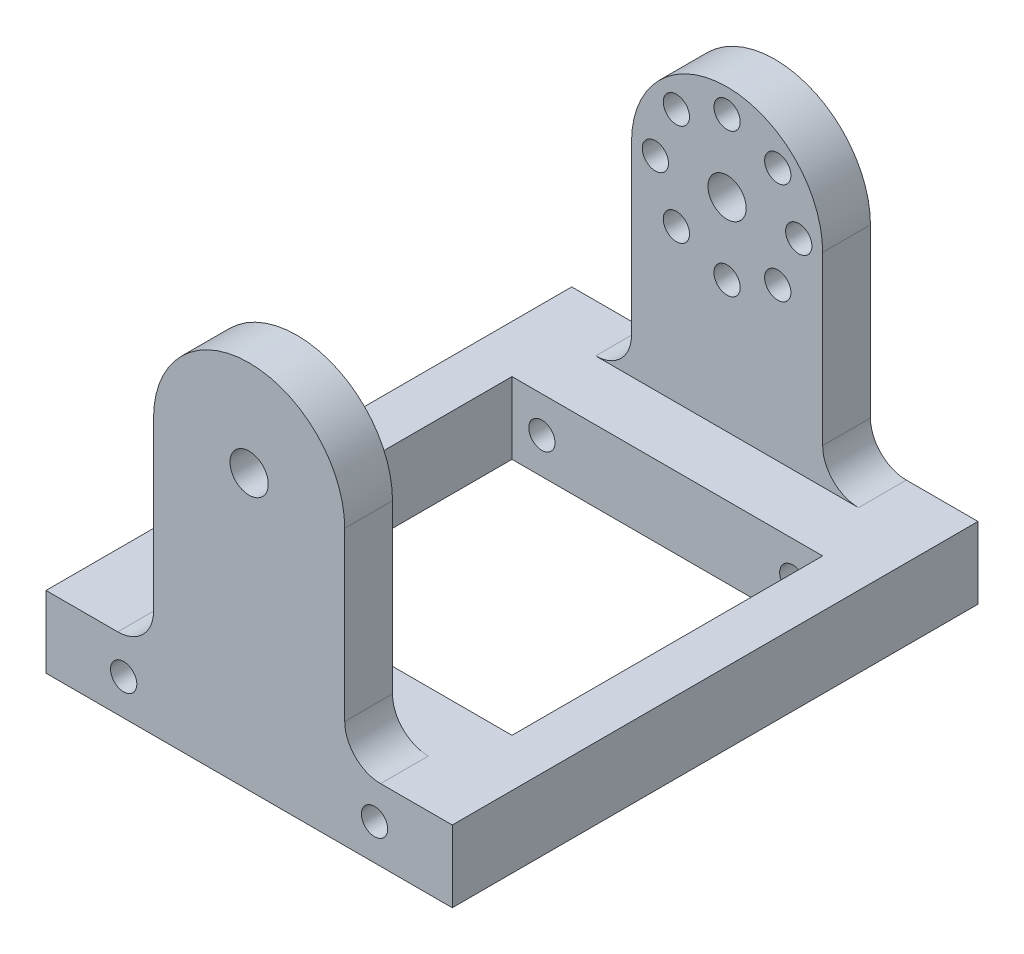
ISO-10303-21;
HEADER;
FILE_DESCRIPTION(('STEP AP214'),'2;1');
FILE_NAME('part.step','',(''),(''),'','','');
FILE_SCHEMA(('AUTOMOTIVE_DESIGN { 1 0 10303 214 1 1 1 1 }'));
ENDSEC;
DATA;
#1=APPLICATION_CONTEXT('core data for automotive mechanical design processes');
#2=APPLICATION_PROTOCOL_DEFINITION('international standard','automotive_design',2000,#1);
#3=PRODUCT_CONTEXT('',#1,'mechanical');
#4=PRODUCT('Part','Part','',(#3));
#5=PRODUCT_RELATED_PRODUCT_CATEGORY('part','',(#4));
#6=PRODUCT_DEFINITION_FORMATION('','',#4);
#7=PRODUCT_DEFINITION_CONTEXT('part definition',#1,'design');
#8=PRODUCT_DEFINITION('design','',#6,#7);
#9=PRODUCT_DEFINITION_SHAPE('','',#8);
#10=(LENGTH_UNIT() NAMED_UNIT(*) SI_UNIT(.MILLI.,.METRE.));
#11=(NAMED_UNIT(*) PLANE_ANGLE_UNIT() SI_UNIT($,.RADIAN.));
#12=(NAMED_UNIT(*) SI_UNIT($,.STERADIAN.) SOLID_ANGLE_UNIT());
#13=UNCERTAINTY_MEASURE_WITH_UNIT(LENGTH_MEASURE(1.E-05),#10,'distance_accuracy_value','');
#14=(GEOMETRIC_REPRESENTATION_CONTEXT(3) GLOBAL_UNCERTAINTY_ASSIGNED_CONTEXT((#13)) GLOBAL_UNIT_ASSIGNED_CONTEXT((#10,
#11,#12)) REPRESENTATION_CONTEXT('',''));
#15=CARTESIAN_POINT('',(0.,0.,0.));
#16=DIRECTION('',(0.,0.,1.));
#17=DIRECTION('',(1.,0.,0.));
#18=AXIS2_PLACEMENT_3D('',#15,#16,#17);
#19=CARTESIAN_POINT('',(11.,-14.,4.));
#20=DIRECTION('',(0.,0.,1.));
#21=DIRECTION('',(1.,0.,0.));
#22=AXIS2_PLACEMENT_3D('',#19,#20,#21);
#23=PLANE('',#22);
#24=CARTESIAN_POINT('',(-6.,0.,4.));
#25=DIRECTION('',(0.,0.,1.));
#26=DIRECTION('',(1.,0.,0.));
#27=AXIS2_PLACEMENT_3D('',#24,#25,#26);
#28=CIRCLE('',#27,1.1);
#29=CARTESIAN_POINT('',(-4.9,0.,4.));
#30=VERTEX_POINT('',#29);
#31=EDGE_CURVE('E221',#30,#30,#28,.T.);
#32=ORIENTED_EDGE('',*,*,#31,.F.);
#33=EDGE_LOOP('',(#32));
#34=FACE_BOUND('',#33,.T.);
#35=CARTESIAN_POINT('',(0.,-6.,4.));
#36=DIRECTION('',(0.,0.,1.));
#37=DIRECTION('',(1.,0.,0.));
#38=AXIS2_PLACEMENT_3D('',#35,#36,#37);
#39=CIRCLE('',#38,1.1);
#40=CARTESIAN_POINT('',(1.1,-6.,4.));
#41=VERTEX_POINT('',#40);
#42=EDGE_CURVE('E233',#41,#41,#39,.T.);
#43=ORIENTED_EDGE('',*,*,#42,.F.);
#44=EDGE_LOOP('',(#43));
#45=FACE_BOUND('',#44,.T.);
#46=CARTESIAN_POINT('',(6.,0.,4.));
#47=DIRECTION('',(0.,0.,1.));
#48=DIRECTION('',(1.,0.,0.));
#49=AXIS2_PLACEMENT_3D('',#46,#47,#48);
#50=CIRCLE('',#49,1.1);
#51=CARTESIAN_POINT('',(7.1,0.,4.));
#52=VERTEX_POINT('',#51);
#53=EDGE_CURVE('E245',#52,#52,#50,.T.);
#54=ORIENTED_EDGE('',*,*,#53,.F.);
#55=EDGE_LOOP('',(#54));
#56=FACE_BOUND('',#55,.T.);
#57=CARTESIAN_POINT('',(0.,6.,4.));
#58=DIRECTION('',(0.,0.,1.));
#59=DIRECTION('',(1.,0.,0.));
#60=AXIS2_PLACEMENT_3D('',#57,#58,#59);
#61=CIRCLE('',#60,1.1);
#62=CARTESIAN_POINT('',(1.1,6.,4.));
#63=VERTEX_POINT('',#62);
#64=EDGE_CURVE('E257',#63,#63,#61,.T.);
#65=ORIENTED_EDGE('',*,*,#64,.F.);
#66=EDGE_LOOP('',(#65));
#67=FACE_BOUND('',#66,.T.);
#68=CARTESIAN_POINT('',(0.,0.,4.));
#69=DIRECTION('',(0.,0.,1.));
#70=DIRECTION('',(1.,0.,0.));
#71=AXIS2_PLACEMENT_3D('',#68,#69,#70);
#72=CIRCLE('',#71,1.6);
#73=CARTESIAN_POINT('',(1.6,0.,4.));
#74=VERTEX_POINT('',#73);
#75=EDGE_CURVE('E263',#74,#74,#72,.T.);
#76=ORIENTED_EDGE('',*,*,#75,.F.);
#77=EDGE_LOOP('',(#76));
#78=FACE_BOUND('',#77,.T.);
#79=CARTESIAN_POINT('',(4.24264068711928,4.24264068711929,4.));
#80=DIRECTION('',(0.,0.,1.));
#81=DIRECTION('',(1.,0.,0.));
#82=AXIS2_PLACEMENT_3D('',#79,#80,#81);
#83=CIRCLE('',#82,1.1);
#84=CARTESIAN_POINT('',(5.34264068711929,4.24264068711929,4.));
#85=VERTEX_POINT('',#84);
#86=EDGE_CURVE('E251',#85,#85,#83,.T.);
#87=ORIENTED_EDGE('',*,*,#86,.F.);
#88=EDGE_LOOP('',(#87));
#89=FACE_BOUND('',#88,.T.);
#90=CARTESIAN_POINT('',(4.24264068711929,-4.24264068711928,4.));
#91=DIRECTION('',(0.,0.,1.));
#92=DIRECTION('',(1.,0.,0.));
#93=AXIS2_PLACEMENT_3D('',#90,#91,#92);
#94=CIRCLE('',#93,1.1);
#95=CARTESIAN_POINT('',(5.34264068711929,-4.24264068711928,4.));
#96=VERTEX_POINT('',#95);
#97=EDGE_CURVE('E239',#96,#96,#94,.T.);
#98=ORIENTED_EDGE('',*,*,#97,.F.);
#99=EDGE_LOOP('',(#98));
#100=FACE_BOUND('',#99,.T.);
#101=CARTESIAN_POINT('',(-4.24264068711928,-4.24264068711929,4.));
#102=DIRECTION('',(0.,0.,1.));
#103=DIRECTION('',(1.,0.,0.));
#104=AXIS2_PLACEMENT_3D('',#101,#102,#103);
#105=CIRCLE('',#104,1.1);
#106=CARTESIAN_POINT('',(-3.14264068711928,-4.24264068711929,4.));
#107=VERTEX_POINT('',#106);
#108=EDGE_CURVE('E227',#107,#107,#105,.T.);
#109=ORIENTED_EDGE('',*,*,#108,.F.);
#110=EDGE_LOOP('',(#109));
#111=FACE_BOUND('',#110,.T.);
#112=CARTESIAN_POINT('',(-4.24264068711929,4.24264068711928,4.));
#113=DIRECTION('',(0.,0.,1.));
#114=DIRECTION('',(1.,0.,0.));
#115=AXIS2_PLACEMENT_3D('',#112,#113,#114);
#116=CIRCLE('',#115,1.1);
#117=CARTESIAN_POINT('',(-3.14264068711928,4.24264068711928,4.));
#118=VERTEX_POINT('',#117);
#119=EDGE_CURVE('E215',#118,#118,#116,.T.);
#120=ORIENTED_EDGE('',*,*,#119,.F.);
#121=EDGE_LOOP('',(#120));
#122=FACE_BOUND('',#121,.T.);
#123=CARTESIAN_POINT('',(-11.,-14.,4.));
#124=DIRECTION('',(0.,0.,-1.));
#125=DIRECTION('',(-1.,0.,0.));
#126=AXIS2_PLACEMENT_3D('',#123,#124,#125);
#127=CIRCLE('',#126,3.);
#128=CARTESIAN_POINT('',(-8.,-14.,4.));
#129=VERTEX_POINT('',#128);
#130=CARTESIAN_POINT('',(-11.,-17.,4.));
#131=VERTEX_POINT('',#130);
#132=EDGE_CURVE('E275',#129,#131,#127,.T.);
#133=ORIENTED_EDGE('',*,*,#132,.T.);
#134=DIRECTION('',(-1.,0.,0.));
#135=VECTOR('',#134,1.);
#136=CARTESIAN_POINT('',(13.,-17.,4.));
#137=LINE('',#136,#135);
#138=CARTESIAN_POINT('',(11.,-17.,4.));
#139=VERTEX_POINT('',#138);
#140=EDGE_CURVE('E345',#139,#131,#137,.T.);
#141=ORIENTED_EDGE('',*,*,#140,.F.);
#142=CARTESIAN_POINT('',(11.,-14.,4.));
#143=DIRECTION('',(0.,0.,-1.));
#144=DIRECTION('',(1.,0.,0.));
#145=AXIS2_PLACEMENT_3D('',#142,#143,#144);
#146=CIRCLE('',#145,3.);
#147=CARTESIAN_POINT('',(8.,-14.,4.));
#148=VERTEX_POINT('',#147);
#149=EDGE_CURVE('E102',#139,#148,#146,.T.);
#150=ORIENTED_EDGE('',*,*,#149,.T.);
#151=DIRECTION('',(0.,1.,0.));
#152=VECTOR('',#151,1.);
#153=CARTESIAN_POINT('',(8.,0.,4.));
#154=LINE('',#153,#152);
#155=CARTESIAN_POINT('',(8.,0.,4.));
#156=VERTEX_POINT('',#155);
#157=EDGE_CURVE('E270',#148,#156,#154,.T.);
#158=ORIENTED_EDGE('',*,*,#157,.T.);
#159=CARTESIAN_POINT('',(0.,0.,4.));
#160=DIRECTION('',(0.,0.,1.));
#161=DIRECTION('',(1.,0.,0.));
#162=AXIS2_PLACEMENT_3D('',#159,#160,#161);
#163=CIRCLE('',#162,8.);
#164=CARTESIAN_POINT('',(-8.,0.,4.));
#165=VERTEX_POINT('',#164);
#166=EDGE_CURVE('E272',#156,#165,#163,.T.);
#167=ORIENTED_EDGE('',*,*,#166,.T.);
#168=DIRECTION('',(0.,-1.,0.));
#169=VECTOR('',#168,1.);
#170=CARTESIAN_POINT('',(-8.,0.,4.));
#171=LINE('',#170,#169);
#172=EDGE_CURVE('E52',#165,#129,#171,.T.);
#173=ORIENTED_EDGE('',*,*,#172,.T.);
#174=EDGE_LOOP('',(#133,#141,#150,#158,#167,#173));
#175=FACE_BOUND('',#174,.T.);
#176=ADVANCED_FACE('F33',(#34,#45,#56,#67,#78,#89,#100,#111,#122,#175),#23,.T.);
#177=CARTESIAN_POINT('',(11.,-14.,0.));
#178=DIRECTION('',(0.,0.,1.));
#179=DIRECTION('',(1.,0.,0.));
#180=AXIS2_PLACEMENT_3D('',#177,#178,#179);
#181=PLANE('',#180);
#182=CARTESIAN_POINT('',(10.5,-20.,0.));
#183=DIRECTION('',(0.,0.,-1.));
#184=DIRECTION('',(-1.,0.,0.));
#185=AXIS2_PLACEMENT_3D('',#182,#183,#184);
#186=CIRCLE('',#185,1.10000000000001);
#187=CARTESIAN_POINT('',(9.39999999999999,-20.,0.));
#188=VERTEX_POINT('',#187);
#189=EDGE_CURVE('E320',#188,#188,#186,.T.);
#190=ORIENTED_EDGE('',*,*,#189,.F.);
#191=EDGE_LOOP('',(#190));
#192=FACE_BOUND('',#191,.T.);
#193=CARTESIAN_POINT('',(-10.5,-20.,0.));
#194=DIRECTION('',(0.,0.,-1.));
#195=DIRECTION('',(1.,0.,0.));
#196=AXIS2_PLACEMENT_3D('',#193,#194,#195);
#197=CIRCLE('',#196,1.10000000000001);
#198=CARTESIAN_POINT('',(-9.4,-20.,0.));
#199=VERTEX_POINT('',#198);
#200=EDGE_CURVE('E331',#199,#199,#197,.T.);
#201=ORIENTED_EDGE('',*,*,#200,.F.);
#202=EDGE_LOOP('',(#201));
#203=FACE_BOUND('',#202,.T.);
#204=DIRECTION('',(1.,0.,0.));
#205=VECTOR('',#204,1.);
#206=CARTESIAN_POINT('',(-17.,-23.,0.));
#207=LINE('',#206,#205);
#208=CARTESIAN_POINT('',(-17.,-23.,0.));
#209=VERTEX_POINT('',#208);
#210=CARTESIAN_POINT('',(17.,-23.,0.));
#211=VERTEX_POINT('',#210);
#212=EDGE_CURVE('E266',#209,#211,#207,.T.);
#213=ORIENTED_EDGE('',*,*,#212,.F.);
#214=DIRECTION('',(0.,-1.,0.));
#215=VECTOR('',#214,1.);
#216=CARTESIAN_POINT('',(-17.,-17.,0.));
#217=LINE('',#216,#215);
#218=CARTESIAN_POINT('',(-17.,-17.,0.));
#219=VERTEX_POINT('',#218);
#220=EDGE_CURVE('E95',#219,#209,#217,.T.);
#221=ORIENTED_EDGE('',*,*,#220,.F.);
#222=DIRECTION('',(-1.,0.,0.));
#223=VECTOR('',#222,1.);
#224=CARTESIAN_POINT('',(-11.,-17.,0.));
#225=LINE('',#224,#223);
#226=CARTESIAN_POINT('',(-11.,-17.,0.));
#227=VERTEX_POINT('',#226);
#228=EDGE_CURVE('E88',#227,#219,#225,.T.);
#229=ORIENTED_EDGE('',*,*,#228,.F.);
#230=CARTESIAN_POINT('',(-11.,-14.,0.));
#231=DIRECTION('',(0.,0.,-1.));
#232=DIRECTION('',(-1.,0.,0.));
#233=AXIS2_PLACEMENT_3D('',#230,#231,#232);
#234=CIRCLE('',#233,3.);
#235=CARTESIAN_POINT('',(-8.,-14.,0.));
#236=VERTEX_POINT('',#235);
#237=EDGE_CURVE('E292',#236,#227,#234,.T.);
#238=ORIENTED_EDGE('',*,*,#237,.F.);
#239=DIRECTION('',(0.,-1.,0.));
#240=VECTOR('',#239,1.);
#241=CARTESIAN_POINT('',(-8.,0.,0.));
#242=LINE('',#241,#240);
#243=CARTESIAN_POINT('',(-8.,0.,0.));
#244=VERTEX_POINT('',#243);
#245=EDGE_CURVE('E290',#244,#236,#242,.T.);
#246=ORIENTED_EDGE('',*,*,#245,.F.);
#247=CARTESIAN_POINT('',(0.,0.,0.));
#248=DIRECTION('',(0.,0.,1.));
#249=DIRECTION('',(1.,0.,0.));
#250=AXIS2_PLACEMENT_3D('',#247,#248,#249);
#251=CIRCLE('',#250,8.);
#252=CARTESIAN_POINT('',(8.,0.,0.));
#253=VERTEX_POINT('',#252);
#254=EDGE_CURVE('E288',#253,#244,#251,.T.);
#255=ORIENTED_EDGE('',*,*,#254,.F.);
#256=DIRECTION('',(0.,1.,0.));
#257=VECTOR('',#256,1.);
#258=CARTESIAN_POINT('',(8.,0.,0.));
#259=LINE('',#258,#257);
#260=CARTESIAN_POINT('',(8.,-14.,0.));
#261=VERTEX_POINT('',#260);
#262=EDGE_CURVE('E286',#261,#253,#259,.T.);
#263=ORIENTED_EDGE('',*,*,#262,.F.);
#264=CARTESIAN_POINT('',(11.,-14.,0.));
#265=DIRECTION('',(0.,0.,-1.));
#266=DIRECTION('',(1.,0.,0.));
#267=AXIS2_PLACEMENT_3D('',#264,#265,#266);
#268=CIRCLE('',#267,3.);
#269=CARTESIAN_POINT('',(11.,-17.,0.));
#270=VERTEX_POINT('',#269);
#271=EDGE_CURVE('E284',#270,#261,#268,.T.);
#272=ORIENTED_EDGE('',*,*,#271,.F.);
#273=DIRECTION('',(-1.,0.,0.));
#274=VECTOR('',#273,1.);
#275=CARTESIAN_POINT('',(11.,-17.,0.));
#276=LINE('',#275,#274);
#277=CARTESIAN_POINT('',(17.,-17.,0.));
#278=VERTEX_POINT('',#277);
#279=EDGE_CURVE('E282',#278,#270,#276,.T.);
#280=ORIENTED_EDGE('',*,*,#279,.F.);
#281=DIRECTION('',(0.,1.,0.));
#282=VECTOR('',#281,1.);
#283=CARTESIAN_POINT('',(17.,-23.,0.));
#284=LINE('',#283,#282);
#285=EDGE_CURVE('E280',#211,#278,#284,.T.);
#286=ORIENTED_EDGE('',*,*,#285,.F.);
#287=EDGE_LOOP('',(#213,#221,#229,#238,#246,#255,#263,#272,#280,#286));
#288=FACE_BOUND('',#287,.T.);
#289=CARTESIAN_POINT('',(0.,0.,0.));
#290=DIRECTION('',(0.,0.,1.));
#291=DIRECTION('',(1.,0.,0.));
#292=AXIS2_PLACEMENT_3D('',#289,#290,#291);
#293=CIRCLE('',#292,1.6);
#294=CARTESIAN_POINT('',(1.6,0.,0.));
#295=VERTEX_POINT('',#294);
#296=EDGE_CURVE('E260',#295,#295,#293,.T.);
#297=ORIENTED_EDGE('',*,*,#296,.T.);
#298=EDGE_LOOP('',(#297));
#299=FACE_BOUND('',#298,.T.);
#300=CARTESIAN_POINT('',(0.,6.,0.));
#301=DIRECTION('',(0.,0.,1.));
#302=DIRECTION('',(1.,0.,0.));
#303=AXIS2_PLACEMENT_3D('',#300,#301,#302);
#304=CIRCLE('',#303,1.1);
#305=CARTESIAN_POINT('',(1.1,6.,0.));
#306=VERTEX_POINT('',#305);
#307=EDGE_CURVE('E254',#306,#306,#304,.T.);
#308=ORIENTED_EDGE('',*,*,#307,.T.);
#309=EDGE_LOOP('',(#308));
#310=FACE_BOUND('',#309,.T.);
#311=CARTESIAN_POINT('',(4.24264068711928,4.24264068711929,0.));
#312=DIRECTION('',(0.,0.,1.));
#313=DIRECTION('',(1.,0.,0.));
#314=AXIS2_PLACEMENT_3D('',#311,#312,#313);
#315=CIRCLE('',#314,1.1);
#316=CARTESIAN_POINT('',(5.34264068711929,4.24264068711929,0.));
#317=VERTEX_POINT('',#316);
#318=EDGE_CURVE('E248',#317,#317,#315,.T.);
#319=ORIENTED_EDGE('',*,*,#318,.T.);
#320=EDGE_LOOP('',(#319));
#321=FACE_BOUND('',#320,.T.);
#322=CARTESIAN_POINT('',(6.,0.,0.));
#323=DIRECTION('',(0.,0.,1.));
#324=DIRECTION('',(1.,0.,0.));
#325=AXIS2_PLACEMENT_3D('',#322,#323,#324);
#326=CIRCLE('',#325,1.1);
#327=CARTESIAN_POINT('',(7.1,0.,0.));
#328=VERTEX_POINT('',#327);
#329=EDGE_CURVE('E242',#328,#328,#326,.T.);
#330=ORIENTED_EDGE('',*,*,#329,.T.);
#331=EDGE_LOOP('',(#330));
#332=FACE_BOUND('',#331,.T.);
#333=CARTESIAN_POINT('',(4.24264068711929,-4.24264068711928,0.));
#334=DIRECTION('',(0.,0.,1.));
#335=DIRECTION('',(1.,0.,0.));
#336=AXIS2_PLACEMENT_3D('',#333,#334,#335);
#337=CIRCLE('',#336,1.1);
#338=CARTESIAN_POINT('',(5.34264068711929,-4.24264068711928,0.));
#339=VERTEX_POINT('',#338);
#340=EDGE_CURVE('E236',#339,#339,#337,.T.);
#341=ORIENTED_EDGE('',*,*,#340,.T.);
#342=EDGE_LOOP('',(#341));
#343=FACE_BOUND('',#342,.T.);
#344=CARTESIAN_POINT('',(0.,-6.,0.));
#345=DIRECTION('',(0.,0.,1.));
#346=DIRECTION('',(1.,0.,0.));
#347=AXIS2_PLACEMENT_3D('',#344,#345,#346);
#348=CIRCLE('',#347,1.1);
#349=CARTESIAN_POINT('',(1.1,-6.,0.));
#350=VERTEX_POINT('',#349);
#351=EDGE_CURVE('E230',#350,#350,#348,.T.);
#352=ORIENTED_EDGE('',*,*,#351,.T.);
#353=EDGE_LOOP('',(#352));
#354=FACE_BOUND('',#353,.T.);
#355=CARTESIAN_POINT('',(-4.24264068711928,-4.24264068711929,0.));
#356=DIRECTION('',(0.,0.,1.));
#357=DIRECTION('',(1.,0.,0.));
#358=AXIS2_PLACEMENT_3D('',#355,#356,#357);
#359=CIRCLE('',#358,1.1);
#360=CARTESIAN_POINT('',(-3.14264068711928,-4.24264068711929,0.));
#361=VERTEX_POINT('',#360);
#362=EDGE_CURVE('E224',#361,#361,#359,.T.);
#363=ORIENTED_EDGE('',*,*,#362,.T.);
#364=EDGE_LOOP('',(#363));
#365=FACE_BOUND('',#364,.T.);
#366=CARTESIAN_POINT('',(-6.,0.,0.));
#367=DIRECTION('',(0.,0.,1.));
#368=DIRECTION('',(1.,0.,0.));
#369=AXIS2_PLACEMENT_3D('',#366,#367,#368);
#370=CIRCLE('',#369,1.1);
#371=CARTESIAN_POINT('',(-4.9,0.,0.));
#372=VERTEX_POINT('',#371);
#373=EDGE_CURVE('E218',#372,#372,#370,.T.);
#374=ORIENTED_EDGE('',*,*,#373,.T.);
#375=EDGE_LOOP('',(#374));
#376=FACE_BOUND('',#375,.T.);
#377=CARTESIAN_POINT('',(-4.24264068711929,4.24264068711928,0.));
#378=DIRECTION('',(0.,0.,1.));
#379=DIRECTION('',(1.,0.,0.));
#380=AXIS2_PLACEMENT_3D('',#377,#378,#379);
#381=CIRCLE('',#380,1.1);
#382=CARTESIAN_POINT('',(-3.14264068711928,4.24264068711928,0.));
#383=VERTEX_POINT('',#382);
#384=EDGE_CURVE('E214',#383,#383,#381,.T.);
#385=ORIENTED_EDGE('',*,*,#384,.T.);
#386=EDGE_LOOP('',(#385));
#387=FACE_BOUND('',#386,.T.);
#388=ADVANCED_FACE('F445',(#192,#203,#288,#299,#310,#321,#332,#343,#354,#365,#376,#387),#181,.F.);
#389=CARTESIAN_POINT('',(-17.,-23.,4.));
#390=DIRECTION('',(0.,1.,0.));
#391=DIRECTION('',(0.,0.,1.));
#392=AXIS2_PLACEMENT_3D('',#389,#390,#391);
#393=PLANE('',#392);
#394=DIRECTION('',(0.,0.,-1.));
#395=VECTOR('',#394,1.);
#396=CARTESIAN_POINT('',(-13.,-23.,40.));
#397=LINE('',#396,#395);
#398=CARTESIAN_POINT('',(-13.,-23.,35.));
#399=VERTEX_POINT('',#398);
#400=CARTESIAN_POINT('',(-13.,-23.,9.00000000000001));
#401=VERTEX_POINT('',#400);
#402=EDGE_CURVE('E207',#399,#401,#397,.T.);
#403=ORIENTED_EDGE('',*,*,#402,.F.);
#404=DIRECTION('',(1.,0.,0.));
#405=VECTOR('',#404,1.);
#406=CARTESIAN_POINT('',(13.,-23.,35.));
#407=LINE('',#406,#405);
#408=CARTESIAN_POINT('',(13.,-23.,35.));
#409=VERTEX_POINT('',#408);
#410=EDGE_CURVE('E342',#399,#409,#407,.T.);
#411=ORIENTED_EDGE('',*,*,#410,.T.);
#412=DIRECTION('',(0.,0.,-1.));
#413=VECTOR('',#412,1.);
#414=CARTESIAN_POINT('',(13.,-23.,40.));
#415=LINE('',#414,#413);
#416=CARTESIAN_POINT('',(13.,-23.,9.));
#417=VERTEX_POINT('',#416);
#418=EDGE_CURVE('E199',#409,#417,#415,.T.);
#419=ORIENTED_EDGE('',*,*,#418,.T.);
#420=DIRECTION('',(-1.,0.,0.));
#421=VECTOR('',#420,1.);
#422=CARTESIAN_POINT('',(13.,-23.,9.));
#423=LINE('',#422,#421);
#424=EDGE_CURVE('E346',#417,#401,#423,.T.);
#425=ORIENTED_EDGE('',*,*,#424,.T.);
#426=EDGE_LOOP('',(#403,#411,#419,#425));
#427=FACE_BOUND('',#426,.T.);
#428=ORIENTED_EDGE('',*,*,#212,.T.);
#429=DIRECTION('',(0.,0.,-1.));
#430=VECTOR('',#429,1.);
#431=CARTESIAN_POINT('',(17.,-23.,4.));
#432=LINE('',#431,#430);
#433=CARTESIAN_POINT('',(17.,-23.,44.));
#434=VERTEX_POINT('',#433);
#435=EDGE_CURVE('E11',#434,#211,#432,.T.);
#436=ORIENTED_EDGE('',*,*,#435,.F.);
#437=DIRECTION('',(1.,0.,0.));
#438=VECTOR('',#437,1.);
#439=CARTESIAN_POINT('',(-17.,-23.,44.));
#440=LINE('',#439,#438);
#441=CARTESIAN_POINT('',(-17.,-23.,44.));
#442=VERTEX_POINT('',#441);
#443=EDGE_CURVE('E385',#442,#434,#440,.T.);
#444=ORIENTED_EDGE('',*,*,#443,.F.);
#445=DIRECTION('',(0.,0.,-1.));
#446=VECTOR('',#445,1.);
#447=CARTESIAN_POINT('',(-17.,-23.,4.));
#448=LINE('',#447,#446);
#449=EDGE_CURVE('E277',#442,#209,#448,.T.);
#450=ORIENTED_EDGE('',*,*,#449,.T.);
#451=EDGE_LOOP('',(#428,#436,#444,#450));
#452=FACE_BOUND('',#451,.T.);
#453=ADVANCED_FACE('F35',(#427,#452),#393,.F.);
#454=CARTESIAN_POINT('',(17.,-23.,4.));
#455=DIRECTION('',(-1.,0.,0.));
#456=DIRECTION('',(0.,0.,1.));
#457=AXIS2_PLACEMENT_3D('',#454,#455,#456);
#458=PLANE('',#457);
#459=ORIENTED_EDGE('',*,*,#285,.T.);
#460=DIRECTION('',(0.,0.,-1.));
#461=VECTOR('',#460,1.);
#462=CARTESIAN_POINT('',(17.,-17.,4.));
#463=LINE('',#462,#461);
#464=CARTESIAN_POINT('',(17.,-17.,44.));
#465=VERTEX_POINT('',#464);
#466=EDGE_CURVE('E43',#465,#278,#463,.T.);
#467=ORIENTED_EDGE('',*,*,#466,.F.);
#468=DIRECTION('',(0.,1.,0.));
#469=VECTOR('',#468,1.);
#470=CARTESIAN_POINT('',(17.,-23.,44.));
#471=LINE('',#470,#469);
#472=EDGE_CURVE('E363',#434,#465,#471,.T.);
#473=ORIENTED_EDGE('',*,*,#472,.F.);
#474=ORIENTED_EDGE('',*,*,#435,.T.);
#475=EDGE_LOOP('',(#459,#467,#473,#474));
#476=FACE_BOUND('',#475,.T.);
#477=ADVANCED_FACE('F514',(#476),#458,.F.);
#478=CARTESIAN_POINT('',(11.,-14.,4.));
#479=DIRECTION('',(0.,0.,-1.));
#480=DIRECTION('',(-1.,0.,0.));
#481=AXIS2_PLACEMENT_3D('',#478,#479,#480);
#482=CYLINDRICAL_SURFACE('',#481,3.);
#483=ORIENTED_EDGE('',*,*,#271,.T.);
#484=DIRECTION('',(0.,0.,-1.));
#485=VECTOR('',#484,1.);
#486=CARTESIAN_POINT('',(8.,-14.,4.));
#487=LINE('',#486,#485);
#488=EDGE_CURVE('E310',#148,#261,#487,.T.);
#489=ORIENTED_EDGE('',*,*,#488,.F.);
#490=ORIENTED_EDGE('',*,*,#149,.F.);
#491=DIRECTION('',(0.,0.,-1.));
#492=VECTOR('',#491,1.);
#493=CARTESIAN_POINT('',(11.,-17.,4.));
#494=LINE('',#493,#492);
#495=EDGE_CURVE('E313',#139,#270,#494,.T.);
#496=ORIENTED_EDGE('',*,*,#495,.T.);
#497=EDGE_LOOP('',(#483,#489,#490,#496));
#498=FACE_BOUND('',#497,.T.);
#499=ADVANCED_FACE('F450',(#498),#482,.F.);
#500=CARTESIAN_POINT('',(8.,0.,4.));
#501=DIRECTION('',(-1.,0.,0.));
#502=DIRECTION('',(0.,-1.,0.));
#503=AXIS2_PLACEMENT_3D('',#500,#501,#502);
#504=PLANE('',#503);
#505=ORIENTED_EDGE('',*,*,#262,.T.);
#506=DIRECTION('',(0.,0.,-1.));
#507=VECTOR('',#506,1.);
#508=CARTESIAN_POINT('',(8.,0.,4.));
#509=LINE('',#508,#507);
#510=EDGE_CURVE('E307',#156,#253,#509,.T.);
#511=ORIENTED_EDGE('',*,*,#510,.F.);
#512=ORIENTED_EDGE('',*,*,#157,.F.);
#513=ORIENTED_EDGE('',*,*,#488,.T.);
#514=EDGE_LOOP('',(#505,#511,#512,#513));
#515=FACE_BOUND('',#514,.T.);
#516=ADVANCED_FACE('F453',(#515),#504,.F.);
#517=CARTESIAN_POINT('',(0.,0.,4.));
#518=DIRECTION('',(0.,0.,-1.));
#519=DIRECTION('',(-1.,0.,0.));
#520=AXIS2_PLACEMENT_3D('',#517,#518,#519);
#521=CYLINDRICAL_SURFACE('',#520,8.);
#522=ORIENTED_EDGE('',*,*,#254,.T.);
#523=DIRECTION('',(0.,0.,-1.));
#524=VECTOR('',#523,1.);
#525=CARTESIAN_POINT('',(-8.,0.,4.));
#526=LINE('',#525,#524);
#527=EDGE_CURVE('E304',#165,#244,#526,.T.);
#528=ORIENTED_EDGE('',*,*,#527,.F.);
#529=ORIENTED_EDGE('',*,*,#166,.F.);
#530=ORIENTED_EDGE('',*,*,#510,.T.);
#531=EDGE_LOOP('',(#522,#528,#529,#530));
#532=FACE_BOUND('',#531,.T.);
#533=ADVANCED_FACE('F458',(#532),#521,.T.);
#534=CARTESIAN_POINT('',(-8.,0.,4.));
#535=DIRECTION('',(1.,0.,0.));
#536=DIRECTION('',(0.,1.,0.));
#537=AXIS2_PLACEMENT_3D('',#534,#535,#536);
#538=PLANE('',#537);
#539=ORIENTED_EDGE('',*,*,#245,.T.);
#540=DIRECTION('',(0.,0.,-1.));
#541=VECTOR('',#540,1.);
#542=CARTESIAN_POINT('',(-8.,-14.,4.));
#543=LINE('',#542,#541);
#544=EDGE_CURVE('E301',#129,#236,#543,.T.);
#545=ORIENTED_EDGE('',*,*,#544,.F.);
#546=ORIENTED_EDGE('',*,*,#172,.F.);
#547=ORIENTED_EDGE('',*,*,#527,.T.);
#548=EDGE_LOOP('',(#539,#545,#546,#547));
#549=FACE_BOUND('',#548,.T.);
#550=ADVANCED_FACE('F461',(#549),#538,.F.);
#551=CARTESIAN_POINT('',(-11.,-14.,4.));
#552=DIRECTION('',(0.,0.,-1.));
#553=DIRECTION('',(-1.,0.,0.));
#554=AXIS2_PLACEMENT_3D('',#551,#552,#553);
#555=CYLINDRICAL_SURFACE('',#554,3.);
#556=ORIENTED_EDGE('',*,*,#237,.T.);
#557=DIRECTION('',(0.,0.,-1.));
#558=VECTOR('',#557,1.);
#559=CARTESIAN_POINT('',(-11.,-17.,4.));
#560=LINE('',#559,#558);
#561=EDGE_CURVE('E299',#131,#227,#560,.T.);
#562=ORIENTED_EDGE('',*,*,#561,.F.);
#563=ORIENTED_EDGE('',*,*,#132,.F.);
#564=ORIENTED_EDGE('',*,*,#544,.T.);
#565=EDGE_LOOP('',(#556,#562,#563,#564));
#566=FACE_BOUND('',#565,.T.);
#567=ADVANCED_FACE('F466',(#566),#555,.F.);
#568=CARTESIAN_POINT('',(-11.,-17.,4.));
#569=DIRECTION('',(0.,-1.,0.));
#570=DIRECTION('',(1.,0.,0.));
#571=AXIS2_PLACEMENT_3D('',#568,#569,#570);
#572=PLANE('',#571);
#573=DIRECTION('',(-1.,0.,0.));
#574=VECTOR('',#573,1.);
#575=CARTESIAN_POINT('',(13.,-17.,35.));
#576=LINE('',#575,#574);
#577=CARTESIAN_POINT('',(13.,-17.,35.));
#578=VERTEX_POINT('',#577);
#579=CARTESIAN_POINT('',(-13.,-17.,35.));
#580=VERTEX_POINT('',#579);
#581=EDGE_CURVE('E181',#578,#580,#576,.T.);
#582=ORIENTED_EDGE('',*,*,#581,.T.);
#583=DIRECTION('',(0.,0.,-1.));
#584=VECTOR('',#583,1.);
#585=CARTESIAN_POINT('',(-13.,-17.,40.));
#586=LINE('',#585,#584);
#587=CARTESIAN_POINT('',(-13.,-17.,9.00000000000001));
#588=VERTEX_POINT('',#587);
#589=EDGE_CURVE('E205',#580,#588,#586,.T.);
#590=ORIENTED_EDGE('',*,*,#589,.T.);
#591=DIRECTION('',(1.,0.,0.));
#592=VECTOR('',#591,1.);
#593=CARTESIAN_POINT('',(13.,-17.,9.));
#594=LINE('',#593,#592);
#595=CARTESIAN_POINT('',(13.,-17.,9.));
#596=VERTEX_POINT('',#595);
#597=EDGE_CURVE('E204',#588,#596,#594,.T.);
#598=ORIENTED_EDGE('',*,*,#597,.T.);
#599=DIRECTION('',(0.,0.,-1.));
#600=VECTOR('',#599,1.);
#601=CARTESIAN_POINT('',(13.,-17.,40.));
#602=LINE('',#601,#600);
#603=EDGE_CURVE('E197',#578,#596,#602,.T.);
#604=ORIENTED_EDGE('',*,*,#603,.F.);
#605=EDGE_LOOP('',(#582,#590,#598,#604));
#606=FACE_BOUND('',#605,.T.);
#607=DIRECTION('',(1.,0.,0.));
#608=VECTOR('',#607,1.);
#609=CARTESIAN_POINT('',(13.,-17.,40.));
#610=LINE('',#609,#608);
#611=CARTESIAN_POINT('',(-11.,-17.,40.));
#612=VERTEX_POINT('',#611);
#613=CARTESIAN_POINT('',(11.,-17.,40.));
#614=VERTEX_POINT('',#613);
#615=EDGE_CURVE('E191',#612,#614,#610,.T.);
#616=ORIENTED_EDGE('',*,*,#615,.T.);
#617=DIRECTION('',(0.,0.,-1.));
#618=VECTOR('',#617,1.);
#619=CARTESIAN_POINT('',(11.,-17.,44.));
#620=LINE('',#619,#618);
#621=CARTESIAN_POINT('',(11.,-17.,44.));
#622=VERTEX_POINT('',#621);
#623=EDGE_CURVE('E209',#622,#614,#620,.T.);
#624=ORIENTED_EDGE('',*,*,#623,.F.);
#625=DIRECTION('',(-1.,0.,0.));
#626=VECTOR('',#625,1.);
#627=CARTESIAN_POINT('',(17.,-17.,44.));
#628=LINE('',#627,#626);
#629=EDGE_CURVE('E366',#465,#622,#628,.T.);
#630=ORIENTED_EDGE('',*,*,#629,.F.);
#631=ORIENTED_EDGE('',*,*,#466,.T.);
#632=ORIENTED_EDGE('',*,*,#279,.T.);
#633=ORIENTED_EDGE('',*,*,#495,.F.);
#634=ORIENTED_EDGE('',*,*,#140,.T.);
#635=ORIENTED_EDGE('',*,*,#561,.T.);
#636=ORIENTED_EDGE('',*,*,#228,.T.);
#637=DIRECTION('',(0.,0.,-1.));
#638=VECTOR('',#637,1.);
#639=CARTESIAN_POINT('',(-17.,-17.,4.));
#640=LINE('',#639,#638);
#641=CARTESIAN_POINT('',(-17.,-17.,44.));
#642=VERTEX_POINT('',#641);
#643=EDGE_CURVE('E297',#642,#219,#640,.T.);
#644=ORIENTED_EDGE('',*,*,#643,.F.);
#645=DIRECTION('',(-1.,0.,0.));
#646=VECTOR('',#645,1.);
#647=CARTESIAN_POINT('',(-11.,-17.,44.));
#648=LINE('',#647,#646);
#649=CARTESIAN_POINT('',(-11.,-17.,44.));
#650=VERTEX_POINT('',#649);
#651=EDGE_CURVE('E379',#650,#642,#648,.T.);
#652=ORIENTED_EDGE('',*,*,#651,.F.);
#653=DIRECTION('',(0.,0.,-1.));
#654=VECTOR('',#653,1.);
#655=CARTESIAN_POINT('',(-11.,-17.,44.));
#656=LINE('',#655,#654);
#657=EDGE_CURVE('E388',#650,#612,#656,.T.);
#658=ORIENTED_EDGE('',*,*,#657,.T.);
#659=EDGE_LOOP('',(#616,#624,#630,#631,#632,#633,#634,#635,#636,#644,#652,#658));
#660=FACE_BOUND('',#659,.T.);
#661=ADVANCED_FACE('F202',(#606,#660),#572,.F.);
#662=CARTESIAN_POINT('',(-17.,-17.,4.));
#663=DIRECTION('',(1.,0.,0.));
#664=DIRECTION('',(0.,0.,-1.));
#665=AXIS2_PLACEMENT_3D('',#662,#663,#664);
#666=PLANE('',#665);
#667=ORIENTED_EDGE('',*,*,#220,.T.);
#668=ORIENTED_EDGE('',*,*,#449,.F.);
#669=DIRECTION('',(0.,-1.,0.));
#670=VECTOR('',#669,1.);
#671=CARTESIAN_POINT('',(-17.,-17.,44.));
#672=LINE('',#671,#670);
#673=EDGE_CURVE('E382',#642,#442,#672,.T.);
#674=ORIENTED_EDGE('',*,*,#673,.F.);
#675=ORIENTED_EDGE('',*,*,#643,.T.);
#676=EDGE_LOOP('',(#667,#668,#674,#675));
#677=FACE_BOUND('',#676,.T.);
#678=ADVANCED_FACE('F470',(#677),#666,.F.);
#679=CARTESIAN_POINT('',(0.,0.,4.));
#680=DIRECTION('',(0.,0.,-1.));
#681=DIRECTION('',(-1.,0.,0.));
#682=AXIS2_PLACEMENT_3D('',#679,#680,#681);
#683=CYLINDRICAL_SURFACE('',#682,1.6);
#684=ORIENTED_EDGE('',*,*,#75,.T.);
#685=EDGE_LOOP('',(#684));
#686=FACE_BOUND('',#685,.T.);
#687=ORIENTED_EDGE('',*,*,#296,.F.);
#688=EDGE_LOOP('',(#687));
#689=FACE_BOUND('',#688,.T.);
#690=ADVANCED_FACE('F498',(#686,#689),#683,.F.);
#691=CARTESIAN_POINT('',(0.,6.,4.));
#692=DIRECTION('',(0.,0.,-1.));
#693=DIRECTION('',(-1.,0.,0.));
#694=AXIS2_PLACEMENT_3D('',#691,#692,#693);
#695=CYLINDRICAL_SURFACE('',#694,1.1);
#696=ORIENTED_EDGE('',*,*,#64,.T.);
#697=EDGE_LOOP('',(#696));
#698=FACE_BOUND('',#697,.T.);
#699=ORIENTED_EDGE('',*,*,#307,.F.);
#700=EDGE_LOOP('',(#699));
#701=FACE_BOUND('',#700,.T.);
#702=ADVANCED_FACE('F588',(#698,#701),#695,.F.);
#703=CARTESIAN_POINT('',(4.24264068711928,4.24264068711929,4.));
#704=DIRECTION('',(0.,0.,-1.));
#705=DIRECTION('',(-1.,0.,0.));
#706=AXIS2_PLACEMENT_3D('',#703,#704,#705);
#707=CYLINDRICAL_SURFACE('',#706,1.1);
#708=ORIENTED_EDGE('',*,*,#86,.T.);
#709=EDGE_LOOP('',(#708));
#710=FACE_BOUND('',#709,.T.);
#711=ORIENTED_EDGE('',*,*,#318,.F.);
#712=EDGE_LOOP('',(#711));
#713=FACE_BOUND('',#712,.T.);
#714=ADVANCED_FACE('F585',(#710,#713),#707,.F.);
#715=CARTESIAN_POINT('',(6.,0.,4.));
#716=DIRECTION('',(0.,0.,-1.));
#717=DIRECTION('',(-1.,0.,0.));
#718=AXIS2_PLACEMENT_3D('',#715,#716,#717);
#719=CYLINDRICAL_SURFACE('',#718,1.1);
#720=ORIENTED_EDGE('',*,*,#53,.T.);
#721=EDGE_LOOP('',(#720));
#722=FACE_BOUND('',#721,.T.);
#723=ORIENTED_EDGE('',*,*,#329,.F.);
#724=EDGE_LOOP('',(#723));
#725=FACE_BOUND('',#724,.T.);
#726=ADVANCED_FACE('F581',(#722,#725),#719,.F.);
#727=CARTESIAN_POINT('',(4.24264068711929,-4.24264068711928,4.));
#728=DIRECTION('',(0.,0.,-1.));
#729=DIRECTION('',(-1.,0.,0.));
#730=AXIS2_PLACEMENT_3D('',#727,#728,#729);
#731=CYLINDRICAL_SURFACE('',#730,1.1);
#732=ORIENTED_EDGE('',*,*,#97,.T.);
#733=EDGE_LOOP('',(#732));
#734=FACE_BOUND('',#733,.T.);
#735=ORIENTED_EDGE('',*,*,#340,.F.);
#736=EDGE_LOOP('',(#735));
#737=FACE_BOUND('',#736,.T.);
#738=ADVANCED_FACE('F577',(#734,#737),#731,.F.);
#739=CARTESIAN_POINT('',(0.,-6.,4.));
#740=DIRECTION('',(0.,0.,-1.));
#741=DIRECTION('',(-1.,0.,0.));
#742=AXIS2_PLACEMENT_3D('',#739,#740,#741);
#743=CYLINDRICAL_SURFACE('',#742,1.1);
#744=ORIENTED_EDGE('',*,*,#42,.T.);
#745=EDGE_LOOP('',(#744));
#746=FACE_BOUND('',#745,.T.);
#747=ORIENTED_EDGE('',*,*,#351,.F.);
#748=EDGE_LOOP('',(#747));
#749=FACE_BOUND('',#748,.T.);
#750=ADVANCED_FACE('F573',(#746,#749),#743,.F.);
#751=CARTESIAN_POINT('',(-4.24264068711928,-4.24264068711929,4.));
#752=DIRECTION('',(0.,0.,-1.));
#753=DIRECTION('',(-1.,0.,0.));
#754=AXIS2_PLACEMENT_3D('',#751,#752,#753);
#755=CYLINDRICAL_SURFACE('',#754,1.1);
#756=ORIENTED_EDGE('',*,*,#108,.T.);
#757=EDGE_LOOP('',(#756));
#758=FACE_BOUND('',#757,.T.);
#759=ORIENTED_EDGE('',*,*,#362,.F.);
#760=EDGE_LOOP('',(#759));
#761=FACE_BOUND('',#760,.T.);
#762=ADVANCED_FACE('F569',(#758,#761),#755,.F.);
#763=CARTESIAN_POINT('',(-6.,0.,4.));
#764=DIRECTION('',(0.,0.,-1.));
#765=DIRECTION('',(-1.,0.,0.));
#766=AXIS2_PLACEMENT_3D('',#763,#764,#765);
#767=CYLINDRICAL_SURFACE('',#766,1.1);
#768=ORIENTED_EDGE('',*,*,#31,.T.);
#769=EDGE_LOOP('',(#768));
#770=FACE_BOUND('',#769,.T.);
#771=ORIENTED_EDGE('',*,*,#373,.F.);
#772=EDGE_LOOP('',(#771));
#773=FACE_BOUND('',#772,.T.);
#774=ADVANCED_FACE('F565',(#770,#773),#767,.F.);
#775=CARTESIAN_POINT('',(-4.24264068711929,4.24264068711928,4.));
#776=DIRECTION('',(0.,0.,-1.));
#777=DIRECTION('',(-1.,0.,0.));
#778=AXIS2_PLACEMENT_3D('',#775,#776,#777);
#779=CYLINDRICAL_SURFACE('',#778,1.1);
#780=ORIENTED_EDGE('',*,*,#119,.T.);
#781=EDGE_LOOP('',(#780));
#782=FACE_BOUND('',#781,.T.);
#783=ORIENTED_EDGE('',*,*,#384,.F.);
#784=EDGE_LOOP('',(#783));
#785=FACE_BOUND('',#784,.T.);
#786=ADVANCED_FACE('F558',(#782,#785),#779,.F.);
#787=CARTESIAN_POINT('',(-13.,-23.,40.));
#788=DIRECTION('',(-1.,0.,0.));
#789=DIRECTION('',(0.,0.,1.));
#790=AXIS2_PLACEMENT_3D('',#787,#788,#789);
#791=PLANE('',#790);
#792=ORIENTED_EDGE('',*,*,#589,.F.);
#793=DIRECTION('',(0.,1.,0.));
#794=VECTOR('',#793,1.);
#795=CARTESIAN_POINT('',(-13.,-49.4764045897475,35.));
#796=LINE('',#795,#794);
#797=EDGE_CURVE('E187',#399,#580,#796,.T.);
#798=ORIENTED_EDGE('',*,*,#797,.F.);
#799=ORIENTED_EDGE('',*,*,#402,.T.);
#800=DIRECTION('',(0.,1.,0.));
#801=VECTOR('',#800,1.);
#802=CARTESIAN_POINT('',(-13.,-49.4764045897475,9.00000000000001));
#803=LINE('',#802,#801);
#804=EDGE_CURVE('E353',#401,#588,#803,.T.);
#805=ORIENTED_EDGE('',*,*,#804,.T.);
#806=EDGE_LOOP('',(#792,#798,#799,#805));
#807=FACE_BOUND('',#806,.T.);
#808=ADVANCED_FACE('F526',(#807),#791,.F.);
#809=CARTESIAN_POINT('',(13.,-23.,40.));
#810=DIRECTION('',(1.,0.,0.));
#811=DIRECTION('',(0.,0.,-1.));
#812=AXIS2_PLACEMENT_3D('',#809,#810,#811);
#813=PLANE('',#812);
#814=ORIENTED_EDGE('',*,*,#418,.F.);
#815=DIRECTION('',(0.,1.,0.));
#816=VECTOR('',#815,1.);
#817=CARTESIAN_POINT('',(13.,-49.4764045897475,35.));
#818=LINE('',#817,#816);
#819=EDGE_CURVE('E184',#409,#578,#818,.T.);
#820=ORIENTED_EDGE('',*,*,#819,.T.);
#821=ORIENTED_EDGE('',*,*,#603,.T.);
#822=DIRECTION('',(0.,1.,0.));
#823=VECTOR('',#822,1.);
#824=CARTESIAN_POINT('',(13.,-49.4764045897475,9.));
#825=LINE('',#824,#823);
#826=EDGE_CURVE('E350',#417,#596,#825,.T.);
#827=ORIENTED_EDGE('',*,*,#826,.F.);
#828=EDGE_LOOP('',(#814,#820,#821,#827));
#829=FACE_BOUND('',#828,.T.);
#830=ADVANCED_FACE('F195',(#829),#813,.F.);
#831=CARTESIAN_POINT('',(11.,-14.,40.));
#832=DIRECTION('',(0.,0.,1.));
#833=DIRECTION('',(1.,0.,0.));
#834=AXIS2_PLACEMENT_3D('',#831,#832,#833);
#835=PLANE('',#834);
#836=CARTESIAN_POINT('',(0.,0.,40.));
#837=DIRECTION('',(0.,0.,1.));
#838=DIRECTION('',(1.,0.,0.));
#839=AXIS2_PLACEMENT_3D('',#836,#837,#838);
#840=CIRCLE('',#839,1.6);
#841=CARTESIAN_POINT('',(1.6,0.,40.));
#842=VERTEX_POINT('',#841);
#843=EDGE_CURVE('E349',#842,#842,#840,.T.);
#844=ORIENTED_EDGE('',*,*,#843,.T.);
#845=EDGE_LOOP('',(#844));
#846=FACE_BOUND('',#845,.T.);
#847=CARTESIAN_POINT('',(11.,-14.,40.));
#848=DIRECTION('',(0.,0.,-1.));
#849=DIRECTION('',(1.,0.,0.));
#850=AXIS2_PLACEMENT_3D('',#847,#848,#849);
#851=CIRCLE('',#850,3.);
#852=CARTESIAN_POINT('',(8.,-14.,40.));
#853=VERTEX_POINT('',#852);
#854=EDGE_CURVE('E360',#614,#853,#851,.T.);
#855=ORIENTED_EDGE('',*,*,#854,.F.);
#856=ORIENTED_EDGE('',*,*,#615,.F.);
#857=CARTESIAN_POINT('',(-11.,-14.,40.));
#858=DIRECTION('',(0.,0.,-1.));
#859=DIRECTION('',(1.,0.,0.));
#860=AXIS2_PLACEMENT_3D('',#857,#858,#859);
#861=CIRCLE('',#860,3.);
#862=CARTESIAN_POINT('',(-8.,-14.,40.));
#863=VERTEX_POINT('',#862);
#864=EDGE_CURVE('E367',#863,#612,#861,.T.);
#865=ORIENTED_EDGE('',*,*,#864,.F.);
#866=DIRECTION('',(0.,-1.,0.));
#867=VECTOR('',#866,1.);
#868=CARTESIAN_POINT('',(-8.,0.,40.));
#869=LINE('',#868,#867);
#870=CARTESIAN_POINT('',(-8.,0.,40.));
#871=VERTEX_POINT('',#870);
#872=EDGE_CURVE('E394',#871,#863,#869,.T.);
#873=ORIENTED_EDGE('',*,*,#872,.F.);
#874=CARTESIAN_POINT('',(0.,0.,40.));
#875=DIRECTION('',(0.,0.,1.));
#876=DIRECTION('',(1.,0.,0.));
#877=AXIS2_PLACEMENT_3D('',#874,#875,#876);
#878=CIRCLE('',#877,8.);
#879=CARTESIAN_POINT('',(8.,0.,40.));
#880=VERTEX_POINT('',#879);
#881=EDGE_CURVE('E392',#880,#871,#878,.T.);
#882=ORIENTED_EDGE('',*,*,#881,.F.);
#883=DIRECTION('',(0.,1.,0.));
#884=VECTOR('',#883,1.);
#885=CARTESIAN_POINT('',(8.,-14.,40.));
#886=LINE('',#885,#884);
#887=EDGE_CURVE('E390',#853,#880,#886,.T.);
#888=ORIENTED_EDGE('',*,*,#887,.F.);
#889=EDGE_LOOP('',(#855,#856,#865,#873,#882,#888));
#890=FACE_BOUND('',#889,.T.);
#891=ADVANCED_FACE('F421',(#846,#890),#835,.F.);
#892=CARTESIAN_POINT('',(11.,-14.,44.));
#893=DIRECTION('',(0.,0.,1.));
#894=DIRECTION('',(1.,0.,0.));
#895=AXIS2_PLACEMENT_3D('',#892,#893,#894);
#896=PLANE('',#895);
#897=CARTESIAN_POINT('',(10.5,-20.,44.));
#898=DIRECTION('',(0.,0.,-1.));
#899=DIRECTION('',(-1.,0.,0.));
#900=AXIS2_PLACEMENT_3D('',#897,#898,#899);
#901=CIRCLE('',#900,1.10000000000001);
#902=CARTESIAN_POINT('',(9.39999999999999,-20.,44.));
#903=VERTEX_POINT('',#902);
#904=EDGE_CURVE('E326',#903,#903,#901,.T.);
#905=ORIENTED_EDGE('',*,*,#904,.T.);
#906=EDGE_LOOP('',(#905));
#907=FACE_BOUND('',#906,.T.);
#908=CARTESIAN_POINT('',(-10.5,-20.,44.));
#909=DIRECTION('',(0.,0.,-1.));
#910=DIRECTION('',(1.,0.,0.));
#911=AXIS2_PLACEMENT_3D('',#908,#909,#910);
#912=CIRCLE('',#911,1.10000000000001);
#913=CARTESIAN_POINT('',(-9.4,-20.,44.));
#914=VERTEX_POINT('',#913);
#915=EDGE_CURVE('E336',#914,#914,#912,.T.);
#916=ORIENTED_EDGE('',*,*,#915,.T.);
#917=EDGE_LOOP('',(#916));
#918=FACE_BOUND('',#917,.T.);
#919=ORIENTED_EDGE('',*,*,#472,.T.);
#920=ORIENTED_EDGE('',*,*,#629,.T.);
#921=CARTESIAN_POINT('',(11.,-14.,44.));
#922=DIRECTION('',(0.,0.,-1.));
#923=DIRECTION('',(1.,0.,0.));
#924=AXIS2_PLACEMENT_3D('',#921,#922,#923);
#925=CIRCLE('',#924,3.);
#926=CARTESIAN_POINT('',(8.,-14.,44.));
#927=VERTEX_POINT('',#926);
#928=EDGE_CURVE('E369',#622,#927,#925,.T.);
#929=ORIENTED_EDGE('',*,*,#928,.T.);
#930=DIRECTION('',(0.,1.,0.));
#931=VECTOR('',#930,1.);
#932=CARTESIAN_POINT('',(8.,-14.,44.));
#933=LINE('',#932,#931);
#934=CARTESIAN_POINT('',(8.,0.,44.));
#935=VERTEX_POINT('',#934);
#936=EDGE_CURVE('E371',#927,#935,#933,.T.);
#937=ORIENTED_EDGE('',*,*,#936,.T.);
#938=CARTESIAN_POINT('',(0.,0.,44.));
#939=DIRECTION('',(0.,0.,1.));
#940=DIRECTION('',(1.,0.,0.));
#941=AXIS2_PLACEMENT_3D('',#938,#939,#940);
#942=CIRCLE('',#941,8.);
#943=CARTESIAN_POINT('',(-8.,0.,44.));
#944=VERTEX_POINT('',#943);
#945=EDGE_CURVE('E373',#935,#944,#942,.T.);
#946=ORIENTED_EDGE('',*,*,#945,.T.);
#947=DIRECTION('',(0.,-1.,0.));
#948=VECTOR('',#947,1.);
#949=CARTESIAN_POINT('',(-8.,0.,44.));
#950=LINE('',#949,#948);
#951=CARTESIAN_POINT('',(-8.,-14.,44.));
#952=VERTEX_POINT('',#951);
#953=EDGE_CURVE('E375',#944,#952,#950,.T.);
#954=ORIENTED_EDGE('',*,*,#953,.T.);
#955=CARTESIAN_POINT('',(-11.,-14.,44.));
#956=DIRECTION('',(0.,0.,-1.));
#957=DIRECTION('',(1.,0.,0.));
#958=AXIS2_PLACEMENT_3D('',#955,#956,#957);
#959=CIRCLE('',#958,3.);
#960=EDGE_CURVE('E377',#952,#650,#959,.T.);
#961=ORIENTED_EDGE('',*,*,#960,.T.);
#962=ORIENTED_EDGE('',*,*,#651,.T.);
#963=ORIENTED_EDGE('',*,*,#673,.T.);
#964=ORIENTED_EDGE('',*,*,#443,.T.);
#965=EDGE_LOOP('',(#919,#920,#929,#937,#946,#954,#961,#962,#963,#964));
#966=FACE_BOUND('',#965,.T.);
#967=CARTESIAN_POINT('',(0.,0.,44.));
#968=DIRECTION('',(0.,0.,1.));
#969=DIRECTION('',(1.,0.,0.));
#970=AXIS2_PLACEMENT_3D('',#967,#968,#969);
#971=CIRCLE('',#970,1.6);
#972=CARTESIAN_POINT('',(1.6,0.,44.));
#973=VERTEX_POINT('',#972);
#974=EDGE_CURVE('E357',#973,#973,#971,.T.);
#975=ORIENTED_EDGE('',*,*,#974,.F.);
#976=EDGE_LOOP('',(#975));
#977=FACE_BOUND('',#976,.T.);
#978=ADVANCED_FACE('F435',(#907,#918,#966,#977),#896,.T.);
#979=CARTESIAN_POINT('',(11.,-14.,44.));
#980=DIRECTION('',(0.,0.,-1.));
#981=DIRECTION('',(-1.,0.,0.));
#982=AXIS2_PLACEMENT_3D('',#979,#980,#981);
#983=CYLINDRICAL_SURFACE('',#982,3.);
#984=ORIENTED_EDGE('',*,*,#854,.T.);
#985=DIRECTION('',(0.,0.,-1.));
#986=VECTOR('',#985,1.);
#987=CARTESIAN_POINT('',(8.,-14.,44.));
#988=LINE('',#987,#986);
#989=EDGE_CURVE('E409',#927,#853,#988,.T.);
#990=ORIENTED_EDGE('',*,*,#989,.F.);
#991=ORIENTED_EDGE('',*,*,#928,.F.);
#992=ORIENTED_EDGE('',*,*,#623,.T.);
#993=EDGE_LOOP('',(#984,#990,#991,#992));
#994=FACE_BOUND('',#993,.T.);
#995=ADVANCED_FACE('F416',(#994),#983,.F.);
#996=CARTESIAN_POINT('',(8.,-14.,44.));
#997=DIRECTION('',(-1.,0.,0.));
#998=DIRECTION('',(0.,-1.,0.));
#999=AXIS2_PLACEMENT_3D('',#996,#997,#998);
#1000=PLANE('',#999);
#1001=ORIENTED_EDGE('',*,*,#887,.T.);
#1002=DIRECTION('',(0.,0.,-1.));
#1003=VECTOR('',#1002,1.);
#1004=CARTESIAN_POINT('',(8.,0.,44.));
#1005=LINE('',#1004,#1003);
#1006=EDGE_CURVE('E406',#935,#880,#1005,.T.);
#1007=ORIENTED_EDGE('',*,*,#1006,.F.);
#1008=ORIENTED_EDGE('',*,*,#936,.F.);
#1009=ORIENTED_EDGE('',*,*,#989,.T.);
#1010=EDGE_LOOP('',(#1001,#1007,#1008,#1009));
#1011=FACE_BOUND('',#1010,.T.);
#1012=ADVANCED_FACE('F427',(#1011),#1000,.F.);
#1013=CARTESIAN_POINT('',(0.,0.,44.));
#1014=DIRECTION('',(0.,0.,-1.));
#1015=DIRECTION('',(-1.,0.,0.));
#1016=AXIS2_PLACEMENT_3D('',#1013,#1014,#1015);
#1017=CYLINDRICAL_SURFACE('',#1016,8.);
#1018=ORIENTED_EDGE('',*,*,#881,.T.);
#1019=DIRECTION('',(0.,0.,-1.));
#1020=VECTOR('',#1019,1.);
#1021=CARTESIAN_POINT('',(-8.,0.,44.));
#1022=LINE('',#1021,#1020);
#1023=EDGE_CURVE('E403',#944,#871,#1022,.T.);
#1024=ORIENTED_EDGE('',*,*,#1023,.F.);
#1025=ORIENTED_EDGE('',*,*,#945,.F.);
#1026=ORIENTED_EDGE('',*,*,#1006,.T.);
#1027=EDGE_LOOP('',(#1018,#1024,#1025,#1026));
#1028=FACE_BOUND('',#1027,.T.);
#1029=ADVANCED_FACE('F431',(#1028),#1017,.T.);
#1030=CARTESIAN_POINT('',(-8.,0.,44.));
#1031=DIRECTION('',(1.,0.,0.));
#1032=DIRECTION('',(0.,1.,0.));
#1033=AXIS2_PLACEMENT_3D('',#1030,#1031,#1032);
#1034=PLANE('',#1033);
#1035=ORIENTED_EDGE('',*,*,#872,.T.);
#1036=DIRECTION('',(0.,0.,-1.));
#1037=VECTOR('',#1036,1.);
#1038=CARTESIAN_POINT('',(-8.,-14.,44.));
#1039=LINE('',#1038,#1037);
#1040=EDGE_CURVE('E400',#952,#863,#1039,.T.);
#1041=ORIENTED_EDGE('',*,*,#1040,.F.);
#1042=ORIENTED_EDGE('',*,*,#953,.F.);
#1043=ORIENTED_EDGE('',*,*,#1023,.T.);
#1044=EDGE_LOOP('',(#1035,#1041,#1042,#1043));
#1045=FACE_BOUND('',#1044,.T.);
#1046=ADVANCED_FACE('F477',(#1045),#1034,.F.);
#1047=CARTESIAN_POINT('',(-11.,-14.,44.));
#1048=DIRECTION('',(0.,0.,-1.));
#1049=DIRECTION('',(-1.,0.,0.));
#1050=AXIS2_PLACEMENT_3D('',#1047,#1048,#1049);
#1051=CYLINDRICAL_SURFACE('',#1050,3.);
#1052=ORIENTED_EDGE('',*,*,#864,.T.);
#1053=ORIENTED_EDGE('',*,*,#657,.F.);
#1054=ORIENTED_EDGE('',*,*,#960,.F.);
#1055=ORIENTED_EDGE('',*,*,#1040,.T.);
#1056=EDGE_LOOP('',(#1052,#1053,#1054,#1055));
#1057=FACE_BOUND('',#1056,.T.);
#1058=ADVANCED_FACE('F475',(#1057),#1051,.F.);
#1059=CARTESIAN_POINT('',(0.,0.,44.));
#1060=DIRECTION('',(0.,0.,-1.));
#1061=DIRECTION('',(-1.,0.,0.));
#1062=AXIS2_PLACEMENT_3D('',#1059,#1060,#1061);
#1063=CYLINDRICAL_SURFACE('',#1062,1.6);
#1064=ORIENTED_EDGE('',*,*,#974,.T.);
#1065=EDGE_LOOP('',(#1064));
#1066=FACE_BOUND('',#1065,.T.);
#1067=ORIENTED_EDGE('',*,*,#843,.F.);
#1068=EDGE_LOOP('',(#1067));
#1069=FACE_BOUND('',#1068,.T.);
#1070=ADVANCED_FACE('F484',(#1066,#1069),#1063,.F.);
#1071=CARTESIAN_POINT('',(13.,-49.4764045897475,9.));
#1072=DIRECTION('',(0.,0.,1.));
#1073=DIRECTION('',(1.,0.,0.));
#1074=AXIS2_PLACEMENT_3D('',#1071,#1072,#1073);
#1075=PLANE('',#1074);
#1076=CARTESIAN_POINT('',(10.5,-20.,9.));
#1077=DIRECTION('',(0.,0.,1.));
#1078=DIRECTION('',(1.,0.,0.));
#1079=AXIS2_PLACEMENT_3D('',#1076,#1077,#1078);
#1080=CIRCLE('',#1079,1.10000000000001);
#1081=CARTESIAN_POINT('',(11.6,-20.,9.));
#1082=VERTEX_POINT('',#1081);
#1083=EDGE_CURVE('E192',#1082,#1082,#1080,.F.);
#1084=ORIENTED_EDGE('',*,*,#1083,.T.);
#1085=EDGE_LOOP('',(#1084));
#1086=FACE_BOUND('',#1085,.T.);
#1087=CARTESIAN_POINT('',(-10.5,-20.,9.00000000000001));
#1088=DIRECTION('',(0.,0.,1.));
#1089=DIRECTION('',(1.,0.,0.));
#1090=AXIS2_PLACEMENT_3D('',#1087,#1088,#1089);
#1091=CIRCLE('',#1090,1.10000000000001);
#1092=CARTESIAN_POINT('',(-9.4,-20.,9.00000000000001));
#1093=VERTEX_POINT('',#1092);
#1094=EDGE_CURVE('E319',#1093,#1093,#1091,.F.);
#1095=ORIENTED_EDGE('',*,*,#1094,.T.);
#1096=EDGE_LOOP('',(#1095));
#1097=FACE_BOUND('',#1096,.T.);
#1098=ORIENTED_EDGE('',*,*,#424,.F.);
#1099=ORIENTED_EDGE('',*,*,#826,.T.);
#1100=ORIENTED_EDGE('',*,*,#597,.F.);
#1101=ORIENTED_EDGE('',*,*,#804,.F.);
#1102=EDGE_LOOP('',(#1098,#1099,#1100,#1101));
#1103=FACE_BOUND('',#1102,.T.);
#1104=ADVANCED_FACE('F528',(#1086,#1097,#1103),#1075,.T.);
#1105=CARTESIAN_POINT('',(13.,-49.4764045897475,35.));
#1106=DIRECTION('',(0.,0.,-1.));
#1107=DIRECTION('',(-1.,0.,0.));
#1108=AXIS2_PLACEMENT_3D('',#1105,#1106,#1107);
#1109=PLANE('',#1108);
#1110=CARTESIAN_POINT('',(10.5,-20.,35.));
#1111=DIRECTION('',(0.,0.,-1.));
#1112=DIRECTION('',(-1.,0.,0.));
#1113=AXIS2_PLACEMENT_3D('',#1110,#1111,#1112);
#1114=CIRCLE('',#1113,1.10000000000001);
#1115=CARTESIAN_POINT('',(9.39999999999999,-20.,35.));
#1116=VERTEX_POINT('',#1115);
#1117=EDGE_CURVE('E37',#1116,#1116,#1114,.F.);
#1118=ORIENTED_EDGE('',*,*,#1117,.T.);
#1119=EDGE_LOOP('',(#1118));
#1120=FACE_BOUND('',#1119,.T.);
#1121=CARTESIAN_POINT('',(-10.5,-20.,35.));
#1122=DIRECTION('',(0.,0.,-1.));
#1123=DIRECTION('',(-1.,0.,0.));
#1124=AXIS2_PLACEMENT_3D('',#1121,#1122,#1123);
#1125=CIRCLE('',#1124,1.10000000000001);
#1126=CARTESIAN_POINT('',(-11.6,-20.,35.));
#1127=VERTEX_POINT('',#1126);
#1128=EDGE_CURVE('E317',#1127,#1127,#1125,.F.);
#1129=ORIENTED_EDGE('',*,*,#1128,.T.);
#1130=EDGE_LOOP('',(#1129));
#1131=FACE_BOUND('',#1130,.T.);
#1132=ORIENTED_EDGE('',*,*,#410,.F.);
#1133=ORIENTED_EDGE('',*,*,#797,.T.);
#1134=ORIENTED_EDGE('',*,*,#581,.F.);
#1135=ORIENTED_EDGE('',*,*,#819,.F.);
#1136=EDGE_LOOP('',(#1132,#1133,#1134,#1135));
#1137=FACE_BOUND('',#1136,.T.);
#1138=ADVANCED_FACE('F183',(#1120,#1131,#1137),#1109,.T.);
#1139=CARTESIAN_POINT('',(-10.5,-20.,0.));
#1140=DIRECTION('',(0.,0.,1.));
#1141=DIRECTION('',(1.,0.,0.));
#1142=AXIS2_PLACEMENT_3D('',#1139,#1140,#1141);
#1143=CYLINDRICAL_SURFACE('',#1142,1.10000000000001);
#1144=ORIENTED_EDGE('',*,*,#1128,.F.);
#1145=EDGE_LOOP('',(#1144));
#1146=FACE_BOUND('',#1145,.T.);
#1147=ORIENTED_EDGE('',*,*,#915,.F.);
#1148=EDGE_LOOP('',(#1147));
#1149=FACE_BOUND('',#1148,.T.);
#1150=ADVANCED_FACE('F536',(#1146,#1149),#1143,.F.);
#1151=CARTESIAN_POINT('',(10.5,-20.,0.));
#1152=DIRECTION('',(0.,0.,1.));
#1153=DIRECTION('',(1.,0.,0.));
#1154=AXIS2_PLACEMENT_3D('',#1151,#1152,#1153);
#1155=CYLINDRICAL_SURFACE('',#1154,1.10000000000001);
#1156=ORIENTED_EDGE('',*,*,#1117,.F.);
#1157=EDGE_LOOP('',(#1156));
#1158=FACE_BOUND('',#1157,.T.);
#1159=ORIENTED_EDGE('',*,*,#904,.F.);
#1160=EDGE_LOOP('',(#1159));
#1161=FACE_BOUND('',#1160,.T.);
#1162=ADVANCED_FACE('F736',(#1158,#1161),#1155,.F.);
#1163=ORIENTED_EDGE('',*,*,#1094,.F.);
#1164=EDGE_LOOP('',(#1163));
#1165=FACE_BOUND('',#1164,.T.);
#1166=ORIENTED_EDGE('',*,*,#200,.T.);
#1167=EDGE_LOOP('',(#1166));
#1168=FACE_BOUND('',#1167,.T.);
#1169=ADVANCED_FACE('F738',(#1165,#1168),#1143,.F.);
#1170=ORIENTED_EDGE('',*,*,#1083,.F.);
#1171=EDGE_LOOP('',(#1170));
#1172=FACE_BOUND('',#1171,.T.);
#1173=ORIENTED_EDGE('',*,*,#189,.T.);
#1174=EDGE_LOOP('',(#1173));
#1175=FACE_BOUND('',#1174,.T.);
#1176=ADVANCED_FACE('F748',(#1172,#1175),#1155,.F.);
#1177=CLOSED_SHELL('',(#176,#388,#453,#477,#499,#516,#533,#550,#567,#661,#678,#690,#702,#714,
#726,#738,#750,#762,#774,#786,#808,#830,#891,#978,#995,#1012,#1029,#1046,#1058,#1070,#1104,
#1138,#1150,#1162,#1169,#1176));
#1178=MANIFOLD_SOLID_BREP('B2',#1177);
#1179=ADVANCED_BREP_SHAPE_REPRESENTATION('',(#18,#1178),#14);
#1180=SHAPE_DEFINITION_REPRESENTATION(#9,#1179);
ENDSEC;
END-ISO-10303-21;
